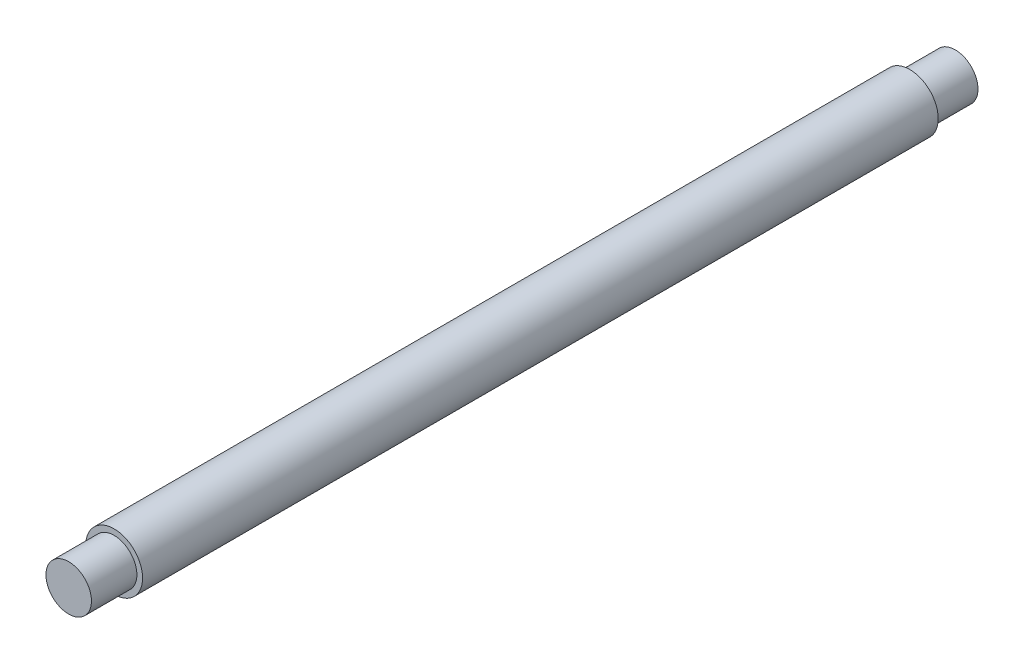
ISO-10303-21;
HEADER;
FILE_DESCRIPTION(('STEP AP214'),'2;1');
FILE_NAME('part.step','',(''),(''),'','','');
FILE_SCHEMA(('AUTOMOTIVE_DESIGN { 1 0 10303 214 1 1 1 1 }'));
ENDSEC;
DATA;
#1=APPLICATION_CONTEXT('core data for automotive mechanical design processes');
#2=APPLICATION_PROTOCOL_DEFINITION('international standard','automotive_design',2000,#1);
#3=PRODUCT_CONTEXT('',#1,'mechanical');
#4=PRODUCT('Part','Part','',(#3));
#5=PRODUCT_RELATED_PRODUCT_CATEGORY('part','',(#4));
#6=PRODUCT_DEFINITION_FORMATION('','',#4);
#7=PRODUCT_DEFINITION_CONTEXT('part definition',#1,'design');
#8=PRODUCT_DEFINITION('design','',#6,#7);
#9=PRODUCT_DEFINITION_SHAPE('','',#8);
#10=(LENGTH_UNIT() NAMED_UNIT(*) SI_UNIT(.MILLI.,.METRE.));
#11=(NAMED_UNIT(*) PLANE_ANGLE_UNIT() SI_UNIT($,.RADIAN.));
#12=(NAMED_UNIT(*) SI_UNIT($,.STERADIAN.) SOLID_ANGLE_UNIT());
#13=UNCERTAINTY_MEASURE_WITH_UNIT(LENGTH_MEASURE(1.E-05),#10,'distance_accuracy_value','');
#14=(GEOMETRIC_REPRESENTATION_CONTEXT(3) GLOBAL_UNCERTAINTY_ASSIGNED_CONTEXT((#13)) GLOBAL_UNIT_ASSIGNED_CONTEXT((#10,
#11,#12)) REPRESENTATION_CONTEXT('',''));
#15=CARTESIAN_POINT('',(0.,0.,0.));
#16=DIRECTION('',(0.,0.,1.));
#17=DIRECTION('',(1.,0.,0.));
#18=AXIS2_PLACEMENT_3D('',#15,#16,#17);
#19=CARTESIAN_POINT('',(0.,0.,70.));
#20=DIRECTION('',(0.,0.,-1.));
#21=DIRECTION('',(-1.,0.,0.));
#22=AXIS2_PLACEMENT_3D('',#19,#20,#21);
#23=CYLINDRICAL_SURFACE('',#22,5.);
#24=CARTESIAN_POINT('',(0.,0.,70.));
#25=DIRECTION('',(0.,0.,1.));
#26=DIRECTION('',(1.,0.,0.));
#27=AXIS2_PLACEMENT_3D('',#24,#25,#26);
#28=CIRCLE('',#27,5.);
#29=CARTESIAN_POINT('',(5.,0.,70.));
#30=VERTEX_POINT('',#29);
#31=EDGE_CURVE('E38',#30,#30,#28,.T.);
#32=ORIENTED_EDGE('',*,*,#31,.F.);
#33=EDGE_LOOP('',(#32));
#34=FACE_BOUND('',#33,.T.);
#35=CARTESIAN_POINT('',(0.,0.,-70.));
#36=DIRECTION('',(0.,0.,1.));
#37=DIRECTION('',(1.,0.,0.));
#38=AXIS2_PLACEMENT_3D('',#35,#36,#37);
#39=CIRCLE('',#38,5.);
#40=CARTESIAN_POINT('',(5.,0.,-70.));
#41=VERTEX_POINT('',#40);
#42=EDGE_CURVE('E34',#41,#41,#39,.T.);
#43=ORIENTED_EDGE('',*,*,#42,.T.);
#44=EDGE_LOOP('',(#43));
#45=FACE_BOUND('',#44,.T.);
#46=ADVANCED_FACE('F31',(#34,#45),#23,.T.);
#47=CARTESIAN_POINT('',(0.,0.,70.));
#48=DIRECTION('',(0.,0.,1.));
#49=DIRECTION('',(1.,0.,0.));
#50=AXIS2_PLACEMENT_3D('',#47,#48,#49);
#51=PLANE('',#50);
#52=CARTESIAN_POINT('',(0.,0.,70.));
#53=DIRECTION('',(0.,0.,1.));
#54=DIRECTION('',(1.,0.,0.));
#55=AXIS2_PLACEMENT_3D('',#52,#53,#54);
#56=CIRCLE('',#55,4.);
#57=CARTESIAN_POINT('',(4.,0.,70.));
#58=VERTEX_POINT('',#57);
#59=EDGE_CURVE('E10',#58,#58,#56,.T.);
#60=ORIENTED_EDGE('',*,*,#59,.F.);
#61=EDGE_LOOP('',(#60));
#62=FACE_BOUND('',#61,.T.);
#63=ORIENTED_EDGE('',*,*,#31,.T.);
#64=EDGE_LOOP('',(#63));
#65=FACE_BOUND('',#64,.T.);
#66=ADVANCED_FACE('F66',(#62,#65),#51,.T.);
#67=CARTESIAN_POINT('',(0.,0.,-70.));
#68=DIRECTION('',(0.,0.,1.));
#69=DIRECTION('',(1.,0.,0.));
#70=AXIS2_PLACEMENT_3D('',#67,#68,#69);
#71=PLANE('',#70);
#72=CARTESIAN_POINT('',(0.,0.,-70.));
#73=DIRECTION('',(0.,0.,1.));
#74=DIRECTION('',(1.,0.,0.));
#75=AXIS2_PLACEMENT_3D('',#72,#73,#74);
#76=CIRCLE('',#75,4.);
#77=CARTESIAN_POINT('',(4.,0.,-70.));
#78=VERTEX_POINT('',#77);
#79=EDGE_CURVE('E48',#78,#78,#76,.T.);
#80=ORIENTED_EDGE('',*,*,#79,.T.);
#81=EDGE_LOOP('',(#80));
#82=FACE_BOUND('',#81,.T.);
#83=ORIENTED_EDGE('',*,*,#42,.F.);
#84=EDGE_LOOP('',(#83));
#85=FACE_BOUND('',#84,.T.);
#86=ADVANCED_FACE('F71',(#82,#85),#71,.F.);
#87=CARTESIAN_POINT('',(0.,0.,78.));
#88=DIRECTION('',(0.,0.,-1.));
#89=DIRECTION('',(-1.,0.,0.));
#90=AXIS2_PLACEMENT_3D('',#87,#88,#89);
#91=CYLINDRICAL_SURFACE('',#90,4.);
#92=CARTESIAN_POINT('',(0.,0.,78.));
#93=DIRECTION('',(0.,0.,1.));
#94=DIRECTION('',(1.,0.,0.));
#95=AXIS2_PLACEMENT_3D('',#92,#93,#94);
#96=CIRCLE('',#95,4.);
#97=CARTESIAN_POINT('',(4.,0.,78.));
#98=VERTEX_POINT('',#97);
#99=EDGE_CURVE('E44',#98,#98,#96,.T.);
#100=ORIENTED_EDGE('',*,*,#99,.F.);
#101=EDGE_LOOP('',(#100));
#102=FACE_BOUND('',#101,.T.);
#103=ORIENTED_EDGE('',*,*,#59,.T.);
#104=EDGE_LOOP('',(#103));
#105=FACE_BOUND('',#104,.T.);
#106=ADVANCED_FACE('F80',(#102,#105),#91,.T.);
#107=CARTESIAN_POINT('',(0.,0.,78.));
#108=DIRECTION('',(0.,0.,1.));
#109=DIRECTION('',(1.,0.,0.));
#110=AXIS2_PLACEMENT_3D('',#107,#108,#109);
#111=PLANE('',#110);
#112=ORIENTED_EDGE('',*,*,#99,.T.);
#113=EDGE_LOOP('',(#112));
#114=FACE_BOUND('',#113,.T.);
#115=ADVANCED_FACE('F63',(#114),#111,.T.);
#116=CARTESIAN_POINT('',(0.,0.,-78.));
#117=DIRECTION('',(0.,0.,1.));
#118=DIRECTION('',(1.,0.,0.));
#119=AXIS2_PLACEMENT_3D('',#116,#117,#118);
#120=CYLINDRICAL_SURFACE('',#119,4.);
#121=CARTESIAN_POINT('',(0.,0.,-78.));
#122=DIRECTION('',(0.,0.,1.));
#123=DIRECTION('',(1.,0.,0.));
#124=AXIS2_PLACEMENT_3D('',#121,#122,#123);
#125=CIRCLE('',#124,4.);
#126=CARTESIAN_POINT('',(4.,0.,-78.));
#127=VERTEX_POINT('',#126);
#128=EDGE_CURVE('E47',#127,#127,#125,.T.);
#129=ORIENTED_EDGE('',*,*,#128,.T.);
#130=EDGE_LOOP('',(#129));
#131=FACE_BOUND('',#130,.T.);
#132=ORIENTED_EDGE('',*,*,#79,.F.);
#133=EDGE_LOOP('',(#132));
#134=FACE_BOUND('',#133,.T.);
#135=ADVANCED_FACE('F54',(#131,#134),#120,.T.);
#136=CARTESIAN_POINT('',(0.,0.,-78.));
#137=DIRECTION('',(0.,0.,-1.));
#138=DIRECTION('',(1.,0.,0.));
#139=AXIS2_PLACEMENT_3D('',#136,#137,#138);
#140=PLANE('',#139);
#141=ORIENTED_EDGE('',*,*,#128,.F.);
#142=EDGE_LOOP('',(#141));
#143=FACE_BOUND('',#142,.T.);
#144=ADVANCED_FACE('F57',(#143),#140,.T.);
#145=CLOSED_SHELL('',(#46,#66,#86,#106,#115,#135,#144));
#146=MANIFOLD_SOLID_BREP('B2',#145);
#147=ADVANCED_BREP_SHAPE_REPRESENTATION('',(#18,#146),#14);
#148=SHAPE_DEFINITION_REPRESENTATION(#9,#147);
ENDSEC;
END-ISO-10303-21;
